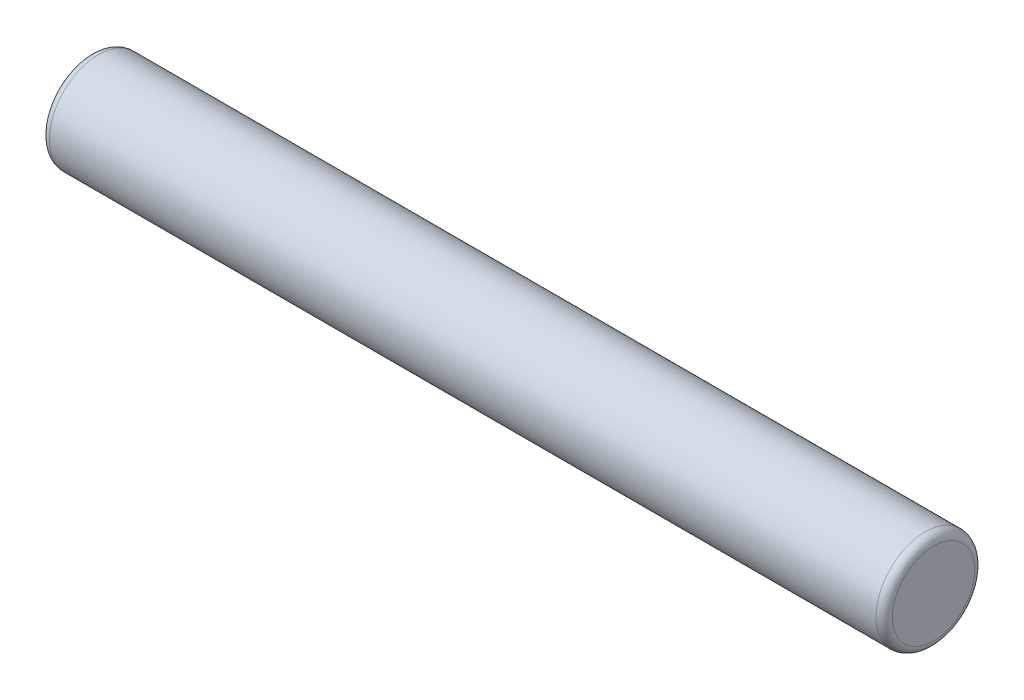
ISO-10303-21;
HEADER;
FILE_DESCRIPTION(('STEP AP214'),'2;1');
FILE_NAME('part.step','',(''),(''),'','','');
FILE_SCHEMA(('AUTOMOTIVE_DESIGN { 1 0 10303 214 1 1 1 1 }'));
ENDSEC;
DATA;
#1=APPLICATION_CONTEXT('core data for automotive mechanical design processes');
#2=APPLICATION_PROTOCOL_DEFINITION('international standard','automotive_design',2000,#1);
#3=PRODUCT_CONTEXT('',#1,'mechanical');
#4=PRODUCT('Part','Part','',(#3));
#5=PRODUCT_RELATED_PRODUCT_CATEGORY('part','',(#4));
#6=PRODUCT_DEFINITION_FORMATION('','',#4);
#7=PRODUCT_DEFINITION_CONTEXT('part definition',#1,'design');
#8=PRODUCT_DEFINITION('design','',#6,#7);
#9=PRODUCT_DEFINITION_SHAPE('','',#8);
#10=(LENGTH_UNIT() NAMED_UNIT(*) SI_UNIT(.MILLI.,.METRE.));
#11=(NAMED_UNIT(*) PLANE_ANGLE_UNIT() SI_UNIT($,.RADIAN.));
#12=(NAMED_UNIT(*) SI_UNIT($,.STERADIAN.) SOLID_ANGLE_UNIT());
#13=UNCERTAINTY_MEASURE_WITH_UNIT(LENGTH_MEASURE(1.E-05),#10,'distance_accuracy_value','');
#14=(GEOMETRIC_REPRESENTATION_CONTEXT(3) GLOBAL_UNCERTAINTY_ASSIGNED_CONTEXT((#13)) GLOBAL_UNIT_ASSIGNED_CONTEXT((#10,
#11,#12)) REPRESENTATION_CONTEXT('',''));
#15=CARTESIAN_POINT('',(0.,0.,0.));
#16=DIRECTION('',(0.,0.,1.));
#17=DIRECTION('',(1.,0.,0.));
#18=AXIS2_PLACEMENT_3D('',#15,#16,#17);
#19=CARTESIAN_POINT('',(25.65,0.,0.));
#20=DIRECTION('',(-1.,0.,0.));
#21=DIRECTION('',(0.,0.,1.));
#22=AXIS2_PLACEMENT_3D('',#19,#20,#21);
#23=CYLINDRICAL_SURFACE('',#22,1.5);
#24=CARTESIAN_POINT('',(0.25,0.,0.));
#25=DIRECTION('',(1.,0.,0.));
#26=DIRECTION('',(0.,0.,-1.));
#27=AXIS2_PLACEMENT_3D('',#24,#25,#26);
#28=CIRCLE('',#27,1.5);
#29=CARTESIAN_POINT('',(0.25,0.,-1.5));
#30=VERTEX_POINT('',#29);
#31=EDGE_CURVE('E42',#30,#30,#28,.T.);
#32=ORIENTED_EDGE('',*,*,#31,.T.);
#33=EDGE_LOOP('',(#32));
#34=FACE_BOUND('',#33,.T.);
#35=CARTESIAN_POINT('',(25.4,0.,0.));
#36=DIRECTION('',(1.,0.,0.));
#37=DIRECTION('',(0.,0.,-1.));
#38=AXIS2_PLACEMENT_3D('',#35,#36,#37);
#39=CIRCLE('',#38,1.5);
#40=CARTESIAN_POINT('',(25.4,0.,-1.5));
#41=VERTEX_POINT('',#40);
#42=EDGE_CURVE('E46',#41,#41,#39,.F.);
#43=ORIENTED_EDGE('',*,*,#42,.T.);
#44=EDGE_LOOP('',(#43));
#45=FACE_BOUND('',#44,.T.);
#46=ADVANCED_FACE('F31',(#34,#45),#23,.T.);
#47=CARTESIAN_POINT('',(25.65,0.,0.));
#48=DIRECTION('',(1.,0.,0.));
#49=DIRECTION('',(0.,0.,-1.));
#50=AXIS2_PLACEMENT_3D('',#47,#48,#49);
#51=PLANE('',#50);
#52=CARTESIAN_POINT('',(25.65,0.,0.));
#53=DIRECTION('',(1.,0.,0.));
#54=DIRECTION('',(0.,0.,-1.));
#55=AXIS2_PLACEMENT_3D('',#52,#53,#54);
#56=CIRCLE('',#55,1.25);
#57=CARTESIAN_POINT('',(25.65,0.,-1.25));
#58=VERTEX_POINT('',#57);
#59=EDGE_CURVE('E10',#58,#58,#56,.T.);
#60=ORIENTED_EDGE('',*,*,#59,.T.);
#61=EDGE_LOOP('',(#60));
#62=FACE_BOUND('',#61,.T.);
#63=ADVANCED_FACE('F62',(#62),#51,.T.);
#64=CARTESIAN_POINT('',(0.,0.,0.));
#65=DIRECTION('',(1.,0.,0.));
#66=DIRECTION('',(0.,0.,-1.));
#67=AXIS2_PLACEMENT_3D('',#64,#65,#66);
#68=PLANE('',#67);
#69=CARTESIAN_POINT('',(0.,0.,0.));
#70=DIRECTION('',(1.,0.,0.));
#71=DIRECTION('',(0.,0.,-1.));
#72=AXIS2_PLACEMENT_3D('',#69,#70,#71);
#73=CIRCLE('',#72,1.25);
#74=CARTESIAN_POINT('',(0.,0.,-1.25));
#75=VERTEX_POINT('',#74);
#76=EDGE_CURVE('E38',#75,#75,#73,.F.);
#77=ORIENTED_EDGE('',*,*,#76,.T.);
#78=EDGE_LOOP('',(#77));
#79=FACE_BOUND('',#78,.T.);
#80=ADVANCED_FACE('F59',(#79),#68,.F.);
#81=CARTESIAN_POINT('',(0.25,0.,0.));
#82=DIRECTION('',(1.,0.,0.));
#83=DIRECTION('',(0.,0.,-1.));
#84=AXIS2_PLACEMENT_3D('',#81,#82,#83);
#85=TOROIDAL_SURFACE('',#84,1.25,0.25);
#86=ORIENTED_EDGE('',*,*,#76,.F.);
#87=EDGE_LOOP('',(#86));
#88=FACE_BOUND('',#87,.T.);
#89=ORIENTED_EDGE('',*,*,#31,.F.);
#90=EDGE_LOOP('',(#89));
#91=FACE_BOUND('',#90,.T.);
#92=ADVANCED_FACE('F55',(#88,#91),#85,.T.);
#93=CARTESIAN_POINT('',(25.4,0.,0.));
#94=DIRECTION('',(1.,0.,0.));
#95=DIRECTION('',(0.,0.,-1.));
#96=AXIS2_PLACEMENT_3D('',#93,#94,#95);
#97=TOROIDAL_SURFACE('',#96,1.25,0.25);
#98=ORIENTED_EDGE('',*,*,#42,.F.);
#99=EDGE_LOOP('',(#98));
#100=FACE_BOUND('',#99,.T.);
#101=ORIENTED_EDGE('',*,*,#59,.F.);
#102=EDGE_LOOP('',(#101));
#103=FACE_BOUND('',#102,.T.);
#104=ADVANCED_FACE('F33',(#100,#103),#97,.T.);
#105=CLOSED_SHELL('',(#46,#63,#80,#92,#104));
#106=MANIFOLD_SOLID_BREP('B2',#105);
#107=ADVANCED_BREP_SHAPE_REPRESENTATION('',(#18,#106),#14);
#108=SHAPE_DEFINITION_REPRESENTATION(#9,#107);
ENDSEC;
END-ISO-10303-21;
